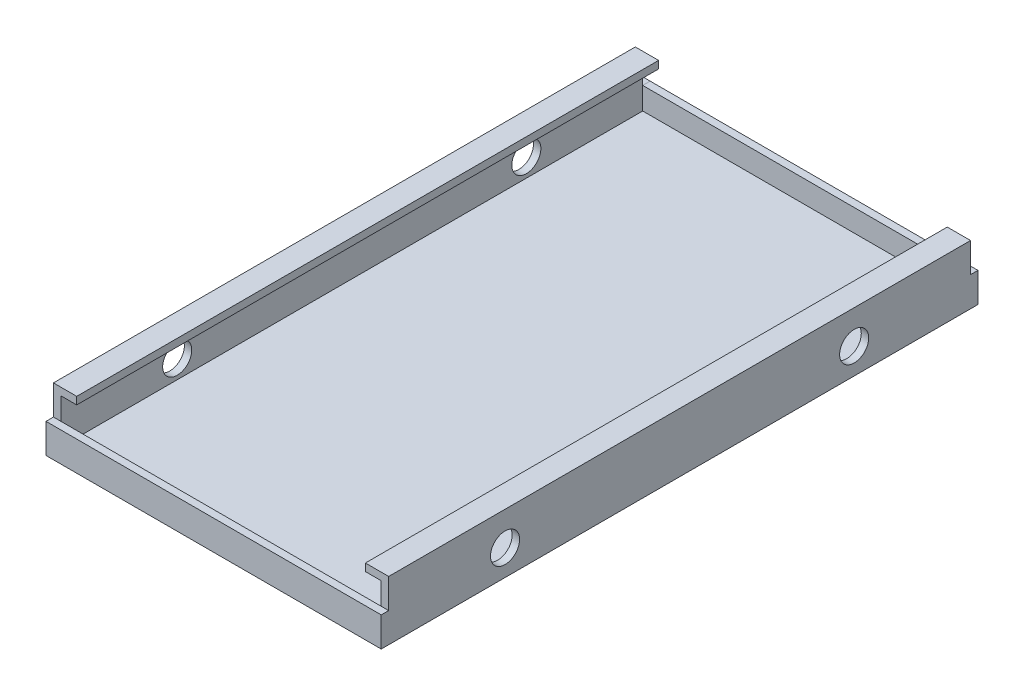
ISO-10303-21;
HEADER;
FILE_DESCRIPTION(('STEP AP214'),'2;1');
FILE_NAME('part.step','',(''),(''),'','','');
FILE_SCHEMA(('AUTOMOTIVE_DESIGN { 1 0 10303 214 1 1 1 1 }'));
ENDSEC;
DATA;
#1=APPLICATION_CONTEXT('core data for automotive mechanical design processes');
#2=APPLICATION_PROTOCOL_DEFINITION('international standard','automotive_design',2000,#1);
#3=PRODUCT_CONTEXT('',#1,'mechanical');
#4=PRODUCT('Part','Part','',(#3));
#5=PRODUCT_RELATED_PRODUCT_CATEGORY('part','',(#4));
#6=PRODUCT_DEFINITION_FORMATION('','',#4);
#7=PRODUCT_DEFINITION_CONTEXT('part definition',#1,'design');
#8=PRODUCT_DEFINITION('design','',#6,#7);
#9=PRODUCT_DEFINITION_SHAPE('','',#8);
#10=(LENGTH_UNIT() NAMED_UNIT(*) SI_UNIT(.MILLI.,.METRE.));
#11=(NAMED_UNIT(*) PLANE_ANGLE_UNIT() SI_UNIT($,.RADIAN.));
#12=(NAMED_UNIT(*) SI_UNIT($,.STERADIAN.) SOLID_ANGLE_UNIT());
#13=UNCERTAINTY_MEASURE_WITH_UNIT(LENGTH_MEASURE(1.E-05),#10,'distance_accuracy_value','');
#14=(GEOMETRIC_REPRESENTATION_CONTEXT(3) GLOBAL_UNCERTAINTY_ASSIGNED_CONTEXT((#13)) GLOBAL_UNIT_ASSIGNED_CONTEXT((#10,
#11,#12)) REPRESENTATION_CONTEXT('',''));
#15=CARTESIAN_POINT('',(0.,0.,0.));
#16=DIRECTION('',(0.,0.,1.));
#17=DIRECTION('',(1.,0.,0.));
#18=AXIS2_PLACEMENT_3D('',#15,#16,#17);
#19=CARTESIAN_POINT('',(0.,0.,500.));
#20=DIRECTION('',(0.,0.,1.));
#21=DIRECTION('',(1.,0.,0.));
#22=AXIS2_PLACEMENT_3D('',#19,#20,#21);
#23=PLANE('',#22);
#24=DIRECTION('',(-1.,0.,0.));
#25=VECTOR('',#24,1.);
#26=CARTESIAN_POINT('',(-76.2,0.0250000000000146,500.));
#27=LINE('',#26,#25);
#28=CARTESIAN_POINT('',(211.865528702967,0.0250000000000042,500.));
#29=VERTEX_POINT('',#28);
#30=CARTESIAN_POINT('',(205.465528702967,0.0250000000000042,500.));
#31=VERTEX_POINT('',#30);
#32=EDGE_CURVE('E46',#29,#31,#27,.T.);
#33=ORIENTED_EDGE('',*,*,#32,.F.);
#34=DIRECTION('',(0.,1.,0.));
#35=VECTOR('',#34,1.);
#36=CARTESIAN_POINT('',(211.865528702967,-25.4,500.));
#37=LINE('',#36,#35);
#38=CARTESIAN_POINT('',(211.865528702967,25.45,500.));
#39=VERTEX_POINT('',#38);
#40=EDGE_CURVE('E311',#29,#39,#37,.T.);
#41=ORIENTED_EDGE('',*,*,#40,.T.);
#42=DIRECTION('',(1.,0.,0.));
#43=VECTOR('',#42,1.);
#44=CARTESIAN_POINT('',(191.865528702967,25.45,500.));
#45=LINE('',#44,#43);
#46=CARTESIAN_POINT('',(191.865528702967,25.45,500.));
#47=VERTEX_POINT('',#46);
#48=EDGE_CURVE('E282',#47,#39,#45,.T.);
#49=ORIENTED_EDGE('',*,*,#48,.F.);
#50=DIRECTION('',(0.,-1.,0.));
#51=VECTOR('',#50,1.);
#52=CARTESIAN_POINT('',(191.865528702967,19.05,500.));
#53=LINE('',#52,#51);
#54=CARTESIAN_POINT('',(191.865528702967,19.05,500.));
#55=VERTEX_POINT('',#54);
#56=EDGE_CURVE('E272',#47,#55,#53,.T.);
#57=ORIENTED_EDGE('',*,*,#56,.T.);
#58=DIRECTION('',(1.,0.,0.));
#59=VECTOR('',#58,1.);
#60=CARTESIAN_POINT('',(191.865528702967,19.05,500.));
#61=LINE('',#60,#59);
#62=CARTESIAN_POINT('',(205.465528702967,19.05,500.));
#63=VERTEX_POINT('',#62);
#64=EDGE_CURVE('E278',#55,#63,#61,.T.);
#65=ORIENTED_EDGE('',*,*,#64,.T.);
#66=DIRECTION('',(0.,-1.,0.));
#67=VECTOR('',#66,1.);
#68=CARTESIAN_POINT('',(205.465528702967,-19.0497371809529,500.));
#69=LINE('',#68,#67);
#70=EDGE_CURVE('E314',#63,#31,#69,.T.);
#71=ORIENTED_EDGE('',*,*,#70,.T.);
#72=EDGE_LOOP('',(#33,#41,#49,#57,#65,#71));
#73=FACE_BOUND('',#72,.T.);
#74=ADVANCED_FACE('F35',(#73),#23,.T.);
#75=CARTESIAN_POINT('',(0.,0.,0.));
#76=DIRECTION('',(0.,0.,1.));
#77=DIRECTION('',(1.,0.,0.));
#78=AXIS2_PLACEMENT_3D('',#75,#76,#77);
#79=PLANE('',#78);
#80=DIRECTION('',(0.999992450686169,0.00388568792744622,0.));
#81=VECTOR('',#80,1.);
#82=CARTESIAN_POINT('',(205.465528702967,0.000131409523540515,0.));
#83=LINE('',#82,#81);
#84=CARTESIAN_POINT('',(205.465528702967,0.000131409523533577,0.));
#85=VERTEX_POINT('',#84);
#86=CARTESIAN_POINT('',(211.865528702967,0.024999999999992,0.));
#87=VERTEX_POINT('',#86);
#88=EDGE_CURVE('E205',#85,#87,#83,.T.);
#89=ORIENTED_EDGE('',*,*,#88,.F.);
#90=DIRECTION('',(0.,-1.,0.));
#91=VECTOR('',#90,1.);
#92=CARTESIAN_POINT('',(205.465528702967,-19.0497371809529,0.));
#93=LINE('',#92,#91);
#94=CARTESIAN_POINT('',(205.465528702967,19.05,0.));
#95=VERTEX_POINT('',#94);
#96=EDGE_CURVE('E329',#95,#85,#93,.T.);
#97=ORIENTED_EDGE('',*,*,#96,.F.);
#98=DIRECTION('',(1.,0.,0.));
#99=VECTOR('',#98,1.);
#100=CARTESIAN_POINT('',(191.865528702967,19.05,0.));
#101=LINE('',#100,#99);
#102=CARTESIAN_POINT('',(191.865528702967,19.05,0.));
#103=VERTEX_POINT('',#102);
#104=EDGE_CURVE('E275',#103,#95,#101,.T.);
#105=ORIENTED_EDGE('',*,*,#104,.F.);
#106=DIRECTION('',(0.,1.,0.));
#107=VECTOR('',#106,1.);
#108=CARTESIAN_POINT('',(191.865528702967,25.45,0.));
#109=LINE('',#108,#107);
#110=CARTESIAN_POINT('',(191.865528702967,25.45,0.));
#111=VERTEX_POINT('',#110);
#112=EDGE_CURVE('E266',#103,#111,#109,.T.);
#113=ORIENTED_EDGE('',*,*,#112,.T.);
#114=DIRECTION('',(1.,0.,0.));
#115=VECTOR('',#114,1.);
#116=CARTESIAN_POINT('',(191.865528702967,25.45,0.));
#117=LINE('',#116,#115);
#118=CARTESIAN_POINT('',(211.865528702967,25.45,0.));
#119=VERTEX_POINT('',#118);
#120=EDGE_CURVE('E285',#111,#119,#117,.T.);
#121=ORIENTED_EDGE('',*,*,#120,.T.);
#122=DIRECTION('',(0.,1.,0.));
#123=VECTOR('',#122,1.);
#124=CARTESIAN_POINT('',(211.865528702967,-25.4,0.));
#125=LINE('',#124,#123);
#126=EDGE_CURVE('E326',#87,#119,#125,.T.);
#127=ORIENTED_EDGE('',*,*,#126,.F.);
#128=EDGE_LOOP('',(#89,#97,#105,#113,#121,#127));
#129=FACE_BOUND('',#128,.T.);
#130=ADVANCED_FACE('F410',(#129),#79,.F.);
#131=DIRECTION('',(0.999992331332652,-0.00391628342795909,0.));
#132=VECTOR('',#131,1.);
#133=CARTESIAN_POINT('',(-76.2,0.0250000000000146,0.));
#134=LINE('',#133,#132);
#135=CARTESIAN_POINT('',(-76.2,0.0250000000000129,0.));
#136=VERTEX_POINT('',#135);
#137=CARTESIAN_POINT('',(-69.85,0.000131409523526638,0.));
#138=VERTEX_POINT('',#137);
#139=EDGE_CURVE('E202',#136,#138,#134,.T.);
#140=ORIENTED_EDGE('',*,*,#139,.F.);
#141=DIRECTION('',(0.,-1.,0.));
#142=VECTOR('',#141,1.);
#143=CARTESIAN_POINT('',(-76.2,-25.4,0.));
#144=LINE('',#143,#142);
#145=CARTESIAN_POINT('',(-76.2,25.45,0.));
#146=VERTEX_POINT('',#145);
#147=EDGE_CURVE('E308',#146,#136,#144,.T.);
#148=ORIENTED_EDGE('',*,*,#147,.F.);
#149=DIRECTION('',(-1.,0.,0.));
#150=VECTOR('',#149,1.);
#151=CARTESIAN_POINT('',(-56.2,25.45,0.));
#152=LINE('',#151,#150);
#153=CARTESIAN_POINT('',(-56.2,25.45,0.));
#154=VERTEX_POINT('',#153);
#155=EDGE_CURVE('E255',#154,#146,#152,.T.);
#156=ORIENTED_EDGE('',*,*,#155,.F.);
#157=DIRECTION('',(0.,-1.,0.));
#158=VECTOR('',#157,1.);
#159=CARTESIAN_POINT('',(-56.2,19.05,0.));
#160=LINE('',#159,#158);
#161=CARTESIAN_POINT('',(-56.2,19.05,0.));
#162=VERTEX_POINT('',#161);
#163=EDGE_CURVE('E245',#154,#162,#160,.T.);
#164=ORIENTED_EDGE('',*,*,#163,.T.);
#165=DIRECTION('',(-1.,0.,0.));
#166=VECTOR('',#165,1.);
#167=CARTESIAN_POINT('',(-56.2,19.05,0.));
#168=LINE('',#167,#166);
#169=CARTESIAN_POINT('',(-69.85,19.05,0.));
#170=VERTEX_POINT('',#169);
#171=EDGE_CURVE('E251',#162,#170,#168,.T.);
#172=ORIENTED_EDGE('',*,*,#171,.T.);
#173=DIRECTION('',(0.,1.,0.));
#174=VECTOR('',#173,1.);
#175=CARTESIAN_POINT('',(-69.85,19.05,0.));
#176=LINE('',#175,#174);
#177=EDGE_CURVE('E334',#138,#170,#176,.T.);
#178=ORIENTED_EDGE('',*,*,#177,.F.);
#179=EDGE_LOOP('',(#140,#148,#156,#164,#172,#178));
#180=FACE_BOUND('',#179,.T.);
#181=ADVANCED_FACE('F363',(#180),#79,.F.);
#182=CARTESIAN_POINT('',(-76.2,-25.4,500.));
#183=DIRECTION('',(1.,0.,0.));
#184=DIRECTION('',(0.,0.,-1.));
#185=AXIS2_PLACEMENT_3D('',#182,#183,#184);
#186=PLANE('',#185);
#187=CARTESIAN_POINT('',(-76.2,-3.19999999999985,400.));
#188=DIRECTION('',(1.,0.,0.));
#189=DIRECTION('',(0.,0.,-1.));
#190=AXIS2_PLACEMENT_3D('',#187,#188,#189);
#191=CIRCLE('',#190,12.5);
#192=CARTESIAN_POINT('',(-76.2,-3.19999999999985,387.5));
#193=VERTEX_POINT('',#192);
#194=EDGE_CURVE('E305',#193,#193,#191,.T.);
#195=ORIENTED_EDGE('',*,*,#194,.T.);
#196=EDGE_LOOP('',(#195));
#197=FACE_BOUND('',#196,.T.);
#198=CARTESIAN_POINT('',(-76.2,-3.19999999999985,100.));
#199=DIRECTION('',(1.,0.,0.));
#200=DIRECTION('',(0.,0.,-1.));
#201=AXIS2_PLACEMENT_3D('',#198,#199,#200);
#202=CIRCLE('',#201,12.5);
#203=CARTESIAN_POINT('',(-76.2,-3.19999999999985,87.5));
#204=VERTEX_POINT('',#203);
#205=EDGE_CURVE('E299',#204,#204,#202,.T.);
#206=ORIENTED_EDGE('',*,*,#205,.T.);
#207=EDGE_LOOP('',(#206));
#208=FACE_BOUND('',#207,.T.);
#209=ORIENTED_EDGE('',*,*,#147,.T.);
#210=DIRECTION('',(0.,0.,1.));
#211=VECTOR('',#210,1.);
#212=CARTESIAN_POINT('',(-76.2,0.0250000000000146,-6.4));
#213=LINE('',#212,#211);
#214=CARTESIAN_POINT('',(-76.2,0.0250000000000146,-6.4));
#215=VERTEX_POINT('',#214);
#216=EDGE_CURVE('E232',#215,#136,#213,.T.);
#217=ORIENTED_EDGE('',*,*,#216,.F.);
#218=DIRECTION('',(0.,1.,0.));
#219=VECTOR('',#218,1.);
#220=CARTESIAN_POINT('',(-76.2,-25.4,-6.4));
#221=LINE('',#220,#219);
#222=CARTESIAN_POINT('',(-76.2,-25.4,-6.4));
#223=VERTEX_POINT('',#222);
#224=EDGE_CURVE('E207',#223,#215,#221,.T.);
#225=ORIENTED_EDGE('',*,*,#224,.F.);
#226=DIRECTION('',(0.,0.,-1.));
#227=VECTOR('',#226,1.);
#228=CARTESIAN_POINT('',(-76.2,-25.4,500.));
#229=LINE('',#228,#227);
#230=CARTESIAN_POINT('',(-76.2,-25.4,506.4));
#231=VERTEX_POINT('',#230);
#232=EDGE_CURVE('E44',#231,#223,#229,.T.);
#233=ORIENTED_EDGE('',*,*,#232,.F.);
#234=DIRECTION('',(0.,-1.,0.));
#235=VECTOR('',#234,1.);
#236=CARTESIAN_POINT('',(-76.2,-25.4,506.4));
#237=LINE('',#236,#235);
#238=CARTESIAN_POINT('',(-76.2,0.0250000000000146,506.4));
#239=VERTEX_POINT('',#238);
#240=EDGE_CURVE('E192',#239,#231,#237,.T.);
#241=ORIENTED_EDGE('',*,*,#240,.F.);
#242=DIRECTION('',(0.,0.,-1.));
#243=VECTOR('',#242,1.);
#244=CARTESIAN_POINT('',(-76.2,0.0250000000000146,506.4));
#245=LINE('',#244,#243);
#246=CARTESIAN_POINT('',(-76.2,0.0250000000000146,500.));
#247=VERTEX_POINT('',#246);
#248=EDGE_CURVE('E197',#239,#247,#245,.T.);
#249=ORIENTED_EDGE('',*,*,#248,.T.);
#250=DIRECTION('',(0.,-1.,0.));
#251=VECTOR('',#250,1.);
#252=CARTESIAN_POINT('',(-76.2,-25.4,500.));
#253=LINE('',#252,#251);
#254=CARTESIAN_POINT('',(-76.2,25.45,500.));
#255=VERTEX_POINT('',#254);
#256=EDGE_CURVE('E309',#255,#247,#253,.T.);
#257=ORIENTED_EDGE('',*,*,#256,.F.);
#258=DIRECTION('',(0.,0.,-1.));
#259=VECTOR('',#258,1.);
#260=CARTESIAN_POINT('',(-76.2,25.45,0.));
#261=LINE('',#260,#259);
#262=EDGE_CURVE('E235',#255,#146,#261,.T.);
#263=ORIENTED_EDGE('',*,*,#262,.T.);
#264=EDGE_LOOP('',(#209,#217,#225,#233,#241,#249,#257,#263));
#265=FACE_BOUND('',#264,.T.);
#266=ADVANCED_FACE('F37',(#197,#208,#265),#186,.F.);
#267=CARTESIAN_POINT('',(76.2,-25.4,500.));
#268=DIRECTION('',(0.,1.,0.));
#269=DIRECTION('',(0.,0.,1.));
#270=AXIS2_PLACEMENT_3D('',#267,#268,#269);
#271=PLANE('',#270);
#272=ORIENTED_EDGE('',*,*,#232,.T.);
#273=DIRECTION('',(-1.,0.,0.));
#274=VECTOR('',#273,1.);
#275=CARTESIAN_POINT('',(211.865528702967,-25.4,-6.4));
#276=LINE('',#275,#274);
#277=CARTESIAN_POINT('',(211.865528702967,-25.4,-6.4));
#278=VERTEX_POINT('',#277);
#279=EDGE_CURVE('E174',#278,#223,#276,.T.);
#280=ORIENTED_EDGE('',*,*,#279,.F.);
#281=DIRECTION('',(0.,0.,-1.));
#282=VECTOR('',#281,1.);
#283=CARTESIAN_POINT('',(211.865528702967,-25.4,500.));
#284=LINE('',#283,#282);
#285=CARTESIAN_POINT('',(211.865528702967,-25.4,506.4));
#286=VERTEX_POINT('',#285);
#287=EDGE_CURVE('E168',#286,#278,#284,.T.);
#288=ORIENTED_EDGE('',*,*,#287,.F.);
#289=DIRECTION('',(1.,0.,0.));
#290=VECTOR('',#289,1.);
#291=CARTESIAN_POINT('',(211.865528702967,-25.4,506.4));
#292=LINE('',#291,#290);
#293=EDGE_CURVE('E172',#231,#286,#292,.T.);
#294=ORIENTED_EDGE('',*,*,#293,.F.);
#295=EDGE_LOOP('',(#272,#280,#288,#294));
#296=FACE_BOUND('',#295,.T.);
#297=ADVANCED_FACE('F170',(#296),#271,.F.);
#298=CARTESIAN_POINT('',(211.865528702967,-25.4,500.));
#299=DIRECTION('',(-1.,0.,0.));
#300=DIRECTION('',(0.,-1.,0.));
#301=AXIS2_PLACEMENT_3D('',#298,#299,#300);
#302=PLANE('',#301);
#303=CARTESIAN_POINT('',(211.865528702967,-3.20000000000001,400.));
#304=DIRECTION('',(1.,0.,0.));
#305=DIRECTION('',(0.,1.,0.));
#306=AXIS2_PLACEMENT_3D('',#303,#304,#305);
#307=CIRCLE('',#306,12.5);
#308=CARTESIAN_POINT('',(211.865528702967,9.3,400.));
#309=VERTEX_POINT('',#308);
#310=EDGE_CURVE('E290',#309,#309,#307,.T.);
#311=ORIENTED_EDGE('',*,*,#310,.F.);
#312=EDGE_LOOP('',(#311));
#313=FACE_BOUND('',#312,.T.);
#314=CARTESIAN_POINT('',(211.865528702967,-3.20000000000001,100.));
#315=DIRECTION('',(1.,0.,0.));
#316=DIRECTION('',(0.,1.,0.));
#317=AXIS2_PLACEMENT_3D('',#314,#315,#316);
#318=CIRCLE('',#317,12.5);
#319=CARTESIAN_POINT('',(211.865528702967,9.3,100.));
#320=VERTEX_POINT('',#319);
#321=EDGE_CURVE('E281',#320,#320,#318,.T.);
#322=ORIENTED_EDGE('',*,*,#321,.F.);
#323=EDGE_LOOP('',(#322));
#324=FACE_BOUND('',#323,.T.);
#325=ORIENTED_EDGE('',*,*,#287,.T.);
#326=DIRECTION('',(0.,-1.,0.));
#327=VECTOR('',#326,1.);
#328=CARTESIAN_POINT('',(211.865528702967,-25.4,-6.4));
#329=LINE('',#328,#327);
#330=CARTESIAN_POINT('',(211.865528702967,0.0249999999999903,-6.4));
#331=VERTEX_POINT('',#330);
#332=EDGE_CURVE('E203',#331,#278,#329,.T.);
#333=ORIENTED_EDGE('',*,*,#332,.F.);
#334=DIRECTION('',(0.,0.,1.));
#335=VECTOR('',#334,1.);
#336=CARTESIAN_POINT('',(211.865528702967,0.0249999999999903,-6.4));
#337=LINE('',#336,#335);
#338=EDGE_CURVE('E216',#331,#87,#337,.T.);
#339=ORIENTED_EDGE('',*,*,#338,.T.);
#340=ORIENTED_EDGE('',*,*,#126,.T.);
#341=DIRECTION('',(0.,0.,1.));
#342=VECTOR('',#341,1.);
#343=CARTESIAN_POINT('',(211.865528702967,25.45,500.));
#344=LINE('',#343,#342);
#345=EDGE_CURVE('E254',#119,#39,#344,.T.);
#346=ORIENTED_EDGE('',*,*,#345,.T.);
#347=ORIENTED_EDGE('',*,*,#40,.F.);
#348=DIRECTION('',(0.,0.,-1.));
#349=VECTOR('',#348,1.);
#350=CARTESIAN_POINT('',(211.865528702967,0.0249999999999903,506.4));
#351=LINE('',#350,#349);
#352=CARTESIAN_POINT('',(211.865528702967,0.0249999999999903,506.4));
#353=VERTEX_POINT('',#352);
#354=EDGE_CURVE('E184',#353,#29,#351,.T.);
#355=ORIENTED_EDGE('',*,*,#354,.F.);
#356=DIRECTION('',(0.,1.,0.));
#357=VECTOR('',#356,1.);
#358=CARTESIAN_POINT('',(211.865528702967,0.0249999999999903,506.4));
#359=LINE('',#358,#357);
#360=EDGE_CURVE('E180',#286,#353,#359,.T.);
#361=ORIENTED_EDGE('',*,*,#360,.F.);
#362=EDGE_LOOP('',(#325,#333,#339,#340,#346,#347,#355,#361));
#363=FACE_BOUND('',#362,.T.);
#364=ADVANCED_FACE('F181',(#313,#324,#363),#302,.F.);
#365=CARTESIAN_POINT('',(205.465528702967,-19.0497371809529,500.));
#366=DIRECTION('',(1.,0.,0.));
#367=DIRECTION('',(0.,0.,-1.));
#368=AXIS2_PLACEMENT_3D('',#365,#366,#367);
#369=PLANE('',#368);
#370=CARTESIAN_POINT('',(205.465528702967,-3.2,400.));
#371=DIRECTION('',(1.,0.,0.));
#372=DIRECTION('',(0.,0.,-1.));
#373=AXIS2_PLACEMENT_3D('',#370,#371,#372);
#374=CIRCLE('',#373,12.5);
#375=CARTESIAN_POINT('',(205.465528702967,-3.2,387.5));
#376=VERTEX_POINT('',#375);
#377=EDGE_CURVE('E302',#376,#376,#374,.T.);
#378=ORIENTED_EDGE('',*,*,#377,.T.);
#379=EDGE_LOOP('',(#378));
#380=FACE_BOUND('',#379,.T.);
#381=CARTESIAN_POINT('',(205.465528702967,-3.2,100.));
#382=DIRECTION('',(1.,0.,0.));
#383=DIRECTION('',(0.,0.,-1.));
#384=AXIS2_PLACEMENT_3D('',#381,#382,#383);
#385=CIRCLE('',#384,12.5);
#386=CARTESIAN_POINT('',(205.465528702967,-3.2,87.5));
#387=VERTEX_POINT('',#386);
#388=EDGE_CURVE('E296',#387,#387,#385,.T.);
#389=ORIENTED_EDGE('',*,*,#388,.T.);
#390=EDGE_LOOP('',(#389));
#391=FACE_BOUND('',#390,.T.);
#392=ORIENTED_EDGE('',*,*,#96,.T.);
#393=CARTESIAN_POINT('',(205.465528702967,-19.0497371809529,0.));
#394=VERTEX_POINT('',#393);
#395=EDGE_CURVE('E328',#85,#394,#93,.T.);
#396=ORIENTED_EDGE('',*,*,#395,.T.);
#397=DIRECTION('',(0.,0.,-1.));
#398=VECTOR('',#397,1.);
#399=CARTESIAN_POINT('',(205.465528702967,-19.0497371809529,500.));
#400=LINE('',#399,#398);
#401=CARTESIAN_POINT('',(205.465528702967,-19.0497371809529,500.));
#402=VERTEX_POINT('',#401);
#403=EDGE_CURVE('E341',#402,#394,#400,.T.);
#404=ORIENTED_EDGE('',*,*,#403,.F.);
#405=EDGE_CURVE('E60',#31,#402,#69,.T.);
#406=ORIENTED_EDGE('',*,*,#405,.F.);
#407=ORIENTED_EDGE('',*,*,#70,.F.);
#408=DIRECTION('',(0.,0.,-1.));
#409=VECTOR('',#408,1.);
#410=CARTESIAN_POINT('',(205.465528702967,19.05,500.));
#411=LINE('',#410,#409);
#412=EDGE_CURVE('E177',#63,#95,#411,.T.);
#413=ORIENTED_EDGE('',*,*,#412,.T.);
#414=EDGE_LOOP('',(#392,#396,#404,#406,#407,#413));
#415=FACE_BOUND('',#414,.T.);
#416=ADVANCED_FACE('F428',(#380,#391,#415),#369,.F.);
#417=CARTESIAN_POINT('',(-69.85,-19.0497371809529,500.));
#418=DIRECTION('',(0.,-1.,0.));
#419=DIRECTION('',(0.,0.,-1.));
#420=AXIS2_PLACEMENT_3D('',#417,#418,#419);
#421=PLANE('',#420);
#422=DIRECTION('',(-1.,0.,0.));
#423=VECTOR('',#422,1.);
#424=CARTESIAN_POINT('',(-69.85,-19.0497371809529,0.));
#425=LINE('',#424,#423);
#426=CARTESIAN_POINT('',(-69.85,-19.0497371809529,0.));
#427=VERTEX_POINT('',#426);
#428=EDGE_CURVE('E332',#394,#427,#425,.T.);
#429=ORIENTED_EDGE('',*,*,#428,.T.);
#430=DIRECTION('',(0.,0.,-1.));
#431=VECTOR('',#430,1.);
#432=CARTESIAN_POINT('',(-69.85,-19.0497371809529,500.));
#433=LINE('',#432,#431);
#434=CARTESIAN_POINT('',(-69.85,-19.0497371809529,500.));
#435=VERTEX_POINT('',#434);
#436=EDGE_CURVE('E338',#435,#427,#433,.T.);
#437=ORIENTED_EDGE('',*,*,#436,.F.);
#438=DIRECTION('',(-1.,0.,0.));
#439=VECTOR('',#438,1.);
#440=CARTESIAN_POINT('',(69.85,-19.0497371809529,500.));
#441=LINE('',#440,#439);
#442=EDGE_CURVE('E316',#402,#435,#441,.T.);
#443=ORIENTED_EDGE('',*,*,#442,.F.);
#444=ORIENTED_EDGE('',*,*,#403,.T.);
#445=EDGE_LOOP('',(#429,#437,#443,#444));
#446=FACE_BOUND('',#445,.T.);
#447=ADVANCED_FACE('F422',(#446),#421,.F.);
#448=CARTESIAN_POINT('',(-69.85,19.05,500.));
#449=DIRECTION('',(-1.,0.,0.));
#450=DIRECTION('',(0.,0.,1.));
#451=AXIS2_PLACEMENT_3D('',#448,#449,#450);
#452=PLANE('',#451);
#453=CARTESIAN_POINT('',(-69.85,-3.19999999999985,400.));
#454=DIRECTION('',(-1.,0.,0.));
#455=DIRECTION('',(0.,0.,1.));
#456=AXIS2_PLACEMENT_3D('',#453,#454,#455);
#457=CIRCLE('',#456,12.5);
#458=CARTESIAN_POINT('',(-69.85,-3.19999999999985,412.5));
#459=VERTEX_POINT('',#458);
#460=EDGE_CURVE('E39',#459,#459,#457,.T.);
#461=ORIENTED_EDGE('',*,*,#460,.T.);
#462=EDGE_LOOP('',(#461));
#463=FACE_BOUND('',#462,.T.);
#464=CARTESIAN_POINT('',(-69.85,-3.19999999999985,100.));
#465=DIRECTION('',(-1.,0.,0.));
#466=DIRECTION('',(0.,0.,1.));
#467=AXIS2_PLACEMENT_3D('',#464,#465,#466);
#468=CIRCLE('',#467,12.5);
#469=CARTESIAN_POINT('',(-69.85,-3.19999999999985,112.5));
#470=VERTEX_POINT('',#469);
#471=EDGE_CURVE('E293',#470,#470,#468,.T.);
#472=ORIENTED_EDGE('',*,*,#471,.T.);
#473=EDGE_LOOP('',(#472));
#474=FACE_BOUND('',#473,.T.);
#475=EDGE_CURVE('E312',#427,#138,#176,.T.);
#476=ORIENTED_EDGE('',*,*,#475,.T.);
#477=ORIENTED_EDGE('',*,*,#177,.T.);
#478=DIRECTION('',(0.,0.,-1.));
#479=VECTOR('',#478,1.);
#480=CARTESIAN_POINT('',(-69.85,19.05,500.));
#481=LINE('',#480,#479);
#482=CARTESIAN_POINT('',(-69.85,19.05,500.));
#483=VERTEX_POINT('',#482);
#484=EDGE_CURVE('E323',#483,#170,#481,.T.);
#485=ORIENTED_EDGE('',*,*,#484,.F.);
#486=DIRECTION('',(0.,1.,0.));
#487=VECTOR('',#486,1.);
#488=CARTESIAN_POINT('',(-69.85,19.05,500.));
#489=LINE('',#488,#487);
#490=CARTESIAN_POINT('',(-69.85,0.0250000000000007,500.));
#491=VERTEX_POINT('',#490);
#492=EDGE_CURVE('E319',#491,#483,#489,.T.);
#493=ORIENTED_EDGE('',*,*,#492,.F.);
#494=EDGE_CURVE('E320',#435,#491,#489,.T.);
#495=ORIENTED_EDGE('',*,*,#494,.F.);
#496=ORIENTED_EDGE('',*,*,#436,.T.);
#497=EDGE_LOOP('',(#476,#477,#485,#493,#495,#496));
#498=FACE_BOUND('',#497,.T.);
#499=ADVANCED_FACE('F349',(#463,#474,#498),#452,.F.);
#500=EDGE_CURVE('E11',#491,#247,#27,.T.);
#501=ORIENTED_EDGE('',*,*,#500,.F.);
#502=ORIENTED_EDGE('',*,*,#492,.T.);
#503=DIRECTION('',(-1.,0.,0.));
#504=VECTOR('',#503,1.);
#505=CARTESIAN_POINT('',(-56.2,19.05,500.));
#506=LINE('',#505,#504);
#507=CARTESIAN_POINT('',(-56.2,19.05,500.));
#508=VERTEX_POINT('',#507);
#509=EDGE_CURVE('E248',#508,#483,#506,.T.);
#510=ORIENTED_EDGE('',*,*,#509,.F.);
#511=DIRECTION('',(0.,1.,0.));
#512=VECTOR('',#511,1.);
#513=CARTESIAN_POINT('',(-56.2,25.45,500.));
#514=LINE('',#513,#512);
#515=CARTESIAN_POINT('',(-56.2,25.45,500.));
#516=VERTEX_POINT('',#515);
#517=EDGE_CURVE('E239',#508,#516,#514,.T.);
#518=ORIENTED_EDGE('',*,*,#517,.T.);
#519=DIRECTION('',(-1.,0.,0.));
#520=VECTOR('',#519,1.);
#521=CARTESIAN_POINT('',(-56.2,25.45,500.));
#522=LINE('',#521,#520);
#523=EDGE_CURVE('E258',#516,#255,#522,.T.);
#524=ORIENTED_EDGE('',*,*,#523,.T.);
#525=ORIENTED_EDGE('',*,*,#256,.T.);
#526=EDGE_LOOP('',(#501,#502,#510,#518,#524,#525));
#527=FACE_BOUND('',#526,.T.);
#528=ADVANCED_FACE('F356',(#527),#23,.T.);
#529=CARTESIAN_POINT('',(-273.782471297033,-3.19999999999974,100.));
#530=DIRECTION('',(1.,0.,0.));
#531=DIRECTION('',(0.,1.,0.));
#532=AXIS2_PLACEMENT_3D('',#529,#530,#531);
#533=CYLINDRICAL_SURFACE('',#532,12.5);
#534=ORIENTED_EDGE('',*,*,#471,.F.);
#535=EDGE_LOOP('',(#534));
#536=FACE_BOUND('',#535,.T.);
#537=ORIENTED_EDGE('',*,*,#205,.F.);
#538=EDGE_LOOP('',(#537));
#539=FACE_BOUND('',#538,.T.);
#540=ADVANCED_FACE('F352',(#536,#539),#533,.F.);
#541=CARTESIAN_POINT('',(-273.782471297033,-3.19999999999974,400.));
#542=DIRECTION('',(1.,0.,0.));
#543=DIRECTION('',(0.,1.,0.));
#544=AXIS2_PLACEMENT_3D('',#541,#542,#543);
#545=CYLINDRICAL_SURFACE('',#544,12.5);
#546=ORIENTED_EDGE('',*,*,#460,.F.);
#547=EDGE_LOOP('',(#546));
#548=FACE_BOUND('',#547,.T.);
#549=ORIENTED_EDGE('',*,*,#194,.F.);
#550=EDGE_LOOP('',(#549));
#551=FACE_BOUND('',#550,.T.);
#552=ADVANCED_FACE('F355',(#548,#551),#545,.F.);
#553=ORIENTED_EDGE('',*,*,#321,.T.);
#554=EDGE_LOOP('',(#553));
#555=FACE_BOUND('',#554,.T.);
#556=ORIENTED_EDGE('',*,*,#388,.F.);
#557=EDGE_LOOP('',(#556));
#558=FACE_BOUND('',#557,.T.);
#559=ADVANCED_FACE('F358',(#555,#558),#533,.F.);
#560=ORIENTED_EDGE('',*,*,#310,.T.);
#561=EDGE_LOOP('',(#560));
#562=FACE_BOUND('',#561,.T.);
#563=ORIENTED_EDGE('',*,*,#377,.F.);
#564=EDGE_LOOP('',(#563));
#565=FACE_BOUND('',#564,.T.);
#566=ADVANCED_FACE('F627',(#562,#565),#545,.F.);
#567=CARTESIAN_POINT('',(191.865528702967,19.05,0.));
#568=DIRECTION('',(0.,-1.,0.));
#569=DIRECTION('',(1.,0.,0.));
#570=AXIS2_PLACEMENT_3D('',#567,#568,#569);
#571=PLANE('',#570);
#572=ORIENTED_EDGE('',*,*,#412,.F.);
#573=ORIENTED_EDGE('',*,*,#64,.F.);
#574=DIRECTION('',(0.,0.,-1.));
#575=VECTOR('',#574,1.);
#576=CARTESIAN_POINT('',(191.865528702967,19.05,0.));
#577=LINE('',#576,#575);
#578=EDGE_CURVE('E263',#55,#103,#577,.T.);
#579=ORIENTED_EDGE('',*,*,#578,.T.);
#580=ORIENTED_EDGE('',*,*,#104,.T.);
#581=EDGE_LOOP('',(#572,#573,#579,#580));
#582=FACE_BOUND('',#581,.T.);
#583=ADVANCED_FACE('F617',(#582),#571,.T.);
#584=CARTESIAN_POINT('',(191.865528702967,25.45,500.));
#585=DIRECTION('',(0.,1.,0.));
#586=DIRECTION('',(-1.,0.,0.));
#587=AXIS2_PLACEMENT_3D('',#584,#585,#586);
#588=PLANE('',#587);
#589=ORIENTED_EDGE('',*,*,#345,.F.);
#590=ORIENTED_EDGE('',*,*,#120,.F.);
#591=DIRECTION('',(0.,0.,1.));
#592=VECTOR('',#591,1.);
#593=CARTESIAN_POINT('',(191.865528702967,25.45,500.));
#594=LINE('',#593,#592);
#595=EDGE_CURVE('E269',#111,#47,#594,.T.);
#596=ORIENTED_EDGE('',*,*,#595,.T.);
#597=ORIENTED_EDGE('',*,*,#48,.T.);
#598=EDGE_LOOP('',(#589,#590,#596,#597));
#599=FACE_BOUND('',#598,.T.);
#600=ADVANCED_FACE('F607',(#599),#588,.T.);
#601=CARTESIAN_POINT('',(191.865528702967,-9.0633181800715E-13,0.));
#602=DIRECTION('',(-1.,0.,0.));
#603=DIRECTION('',(0.,-1.,0.));
#604=AXIS2_PLACEMENT_3D('',#601,#602,#603);
#605=PLANE('',#604);
#606=ORIENTED_EDGE('',*,*,#578,.F.);
#607=ORIENTED_EDGE('',*,*,#56,.F.);
#608=ORIENTED_EDGE('',*,*,#595,.F.);
#609=ORIENTED_EDGE('',*,*,#112,.F.);
#610=EDGE_LOOP('',(#606,#607,#608,#609));
#611=FACE_BOUND('',#610,.T.);
#612=ADVANCED_FACE('F407',(#611),#605,.T.);
#613=CARTESIAN_POINT('',(-56.2,19.05,500.));
#614=DIRECTION('',(0.,-1.,0.));
#615=DIRECTION('',(0.,0.,-1.));
#616=AXIS2_PLACEMENT_3D('',#613,#614,#615);
#617=PLANE('',#616);
#618=ORIENTED_EDGE('',*,*,#484,.T.);
#619=ORIENTED_EDGE('',*,*,#171,.F.);
#620=DIRECTION('',(0.,0.,1.));
#621=VECTOR('',#620,1.);
#622=CARTESIAN_POINT('',(-56.2,19.05,500.));
#623=LINE('',#622,#621);
#624=EDGE_CURVE('E236',#162,#508,#623,.T.);
#625=ORIENTED_EDGE('',*,*,#624,.T.);
#626=ORIENTED_EDGE('',*,*,#509,.T.);
#627=EDGE_LOOP('',(#618,#619,#625,#626));
#628=FACE_BOUND('',#627,.T.);
#629=ADVANCED_FACE('F395',(#628),#617,.T.);
#630=CARTESIAN_POINT('',(-56.2,25.45,0.));
#631=DIRECTION('',(0.,1.,0.));
#632=DIRECTION('',(0.,0.,1.));
#633=AXIS2_PLACEMENT_3D('',#630,#631,#632);
#634=PLANE('',#633);
#635=ORIENTED_EDGE('',*,*,#262,.F.);
#636=ORIENTED_EDGE('',*,*,#523,.F.);
#637=DIRECTION('',(0.,0.,-1.));
#638=VECTOR('',#637,1.);
#639=CARTESIAN_POINT('',(-56.2,25.45,0.));
#640=LINE('',#639,#638);
#641=EDGE_CURVE('E242',#516,#154,#640,.T.);
#642=ORIENTED_EDGE('',*,*,#641,.T.);
#643=ORIENTED_EDGE('',*,*,#155,.T.);
#644=EDGE_LOOP('',(#635,#636,#642,#643));
#645=FACE_BOUND('',#644,.T.);
#646=ADVANCED_FACE('F398',(#645),#634,.T.);
#647=CARTESIAN_POINT('',(-56.2,0.,0.));
#648=DIRECTION('',(1.,0.,0.));
#649=DIRECTION('',(0.,0.,-1.));
#650=AXIS2_PLACEMENT_3D('',#647,#648,#649);
#651=PLANE('',#650);
#652=ORIENTED_EDGE('',*,*,#624,.F.);
#653=ORIENTED_EDGE('',*,*,#163,.F.);
#654=ORIENTED_EDGE('',*,*,#641,.F.);
#655=ORIENTED_EDGE('',*,*,#517,.F.);
#656=EDGE_LOOP('',(#652,#653,#654,#655));
#657=FACE_BOUND('',#656,.T.);
#658=ADVANCED_FACE('F393',(#657),#651,.T.);
#659=CARTESIAN_POINT('',(0.,0.,0.));
#660=DIRECTION('',(0.,0.,1.));
#661=DIRECTION('',(1.,0.,0.));
#662=AXIS2_PLACEMENT_3D('',#659,#660,#661);
#663=PLANE('',#662);
#664=ORIENTED_EDGE('',*,*,#475,.F.);
#665=ORIENTED_EDGE('',*,*,#428,.F.);
#666=ORIENTED_EDGE('',*,*,#395,.F.);
#667=DIRECTION('',(1.,0.,0.));
#668=VECTOR('',#667,1.);
#669=CARTESIAN_POINT('',(205.465528702967,0.000131409523540515,0.));
#670=LINE('',#669,#668);
#671=EDGE_CURVE('E219',#138,#85,#670,.T.);
#672=ORIENTED_EDGE('',*,*,#671,.F.);
#673=EDGE_LOOP('',(#664,#665,#666,#672));
#674=FACE_BOUND('',#673,.T.);
#675=ADVANCED_FACE('F405',(#674),#663,.T.);
#676=CARTESIAN_POINT('',(-76.2,0.0250000000000146,-6.4));
#677=DIRECTION('',(-0.00391628342795909,-0.999992331332652,0.));
#678=DIRECTION('',(0.999992331332652,-0.00391628342795909,0.));
#679=AXIS2_PLACEMENT_3D('',#676,#677,#678);
#680=PLANE('',#679);
#681=ORIENTED_EDGE('',*,*,#139,.T.);
#682=DIRECTION('',(0.,0.,1.));
#683=VECTOR('',#682,1.);
#684=CARTESIAN_POINT('',(-69.85,0.000131409523526638,-6.4));
#685=LINE('',#684,#683);
#686=CARTESIAN_POINT('',(-69.85,0.000131409523526638,-6.4));
#687=VERTEX_POINT('',#686);
#688=EDGE_CURVE('E229',#687,#138,#685,.T.);
#689=ORIENTED_EDGE('',*,*,#688,.F.);
#690=DIRECTION('',(0.999992331332652,-0.00391628342795909,0.));
#691=VECTOR('',#690,1.);
#692=CARTESIAN_POINT('',(-76.2,0.0250000000000146,-6.4));
#693=LINE('',#692,#691);
#694=EDGE_CURVE('E209',#215,#687,#693,.T.);
#695=ORIENTED_EDGE('',*,*,#694,.F.);
#696=ORIENTED_EDGE('',*,*,#216,.T.);
#697=EDGE_LOOP('',(#681,#689,#695,#696));
#698=FACE_BOUND('',#697,.T.);
#699=ADVANCED_FACE('F371',(#698),#680,.F.);
#700=CARTESIAN_POINT('',(205.465528702967,0.000131409523540515,-6.4));
#701=DIRECTION('',(0.,-1.,0.));
#702=DIRECTION('',(1.,0.,0.));
#703=AXIS2_PLACEMENT_3D('',#700,#701,#702);
#704=PLANE('',#703);
#705=ORIENTED_EDGE('',*,*,#671,.T.);
#706=DIRECTION('',(0.,0.,1.));
#707=VECTOR('',#706,1.);
#708=CARTESIAN_POINT('',(205.465528702967,0.000131409523540515,-6.4));
#709=LINE('',#708,#707);
#710=CARTESIAN_POINT('',(205.465528702967,0.000131409523540515,-6.4));
#711=VERTEX_POINT('',#710);
#712=EDGE_CURVE('E226',#711,#85,#709,.T.);
#713=ORIENTED_EDGE('',*,*,#712,.F.);
#714=DIRECTION('',(1.,0.,0.));
#715=VECTOR('',#714,1.);
#716=CARTESIAN_POINT('',(205.465528702967,0.000131409523540515,-6.4));
#717=LINE('',#716,#715);
#718=EDGE_CURVE('E211',#687,#711,#717,.T.);
#719=ORIENTED_EDGE('',*,*,#718,.F.);
#720=ORIENTED_EDGE('',*,*,#688,.T.);
#721=EDGE_LOOP('',(#705,#713,#719,#720));
#722=FACE_BOUND('',#721,.T.);
#723=ADVANCED_FACE('F506',(#722),#704,.F.);
#724=CARTESIAN_POINT('',(205.465528702967,0.000131409523540515,-6.4));
#725=DIRECTION('',(0.00388568792744622,-0.999992450686169,0.));
#726=DIRECTION('',(0.999992450686169,0.00388568792744622,0.));
#727=AXIS2_PLACEMENT_3D('',#724,#725,#726);
#728=PLANE('',#727);
#729=ORIENTED_EDGE('',*,*,#88,.T.);
#730=ORIENTED_EDGE('',*,*,#338,.F.);
#731=DIRECTION('',(0.999992450686169,0.00388568792744622,0.));
#732=VECTOR('',#731,1.);
#733=CARTESIAN_POINT('',(205.465528702967,0.000131409523540515,-6.4));
#734=LINE('',#733,#732);
#735=EDGE_CURVE('E213',#711,#331,#734,.T.);
#736=ORIENTED_EDGE('',*,*,#735,.F.);
#737=ORIENTED_EDGE('',*,*,#712,.T.);
#738=EDGE_LOOP('',(#729,#730,#736,#737));
#739=FACE_BOUND('',#738,.T.);
#740=ADVANCED_FACE('F500',(#739),#728,.F.);
#741=CARTESIAN_POINT('',(0.,0.,-6.4));
#742=DIRECTION('',(0.,0.,1.));
#743=DIRECTION('',(1.,0.,0.));
#744=AXIS2_PLACEMENT_3D('',#741,#742,#743);
#745=PLANE('',#744);
#746=ORIENTED_EDGE('',*,*,#332,.T.);
#747=ORIENTED_EDGE('',*,*,#279,.T.);
#748=ORIENTED_EDGE('',*,*,#224,.T.);
#749=ORIENTED_EDGE('',*,*,#694,.T.);
#750=ORIENTED_EDGE('',*,*,#718,.T.);
#751=ORIENTED_EDGE('',*,*,#735,.T.);
#752=EDGE_LOOP('',(#746,#747,#748,#749,#750,#751));
#753=FACE_BOUND('',#752,.T.);
#754=ADVANCED_FACE('F375',(#753),#745,.F.);
#755=CARTESIAN_POINT('',(-76.2,0.0250000000000146,506.4));
#756=DIRECTION('',(0.,-1.,0.));
#757=DIRECTION('',(1.,0.,0.));
#758=AXIS2_PLACEMENT_3D('',#755,#756,#757);
#759=PLANE('',#758);
#760=ORIENTED_EDGE('',*,*,#32,.T.);
#761=EDGE_CURVE('E47',#31,#491,#27,.T.);
#762=ORIENTED_EDGE('',*,*,#761,.T.);
#763=ORIENTED_EDGE('',*,*,#500,.T.);
#764=ORIENTED_EDGE('',*,*,#248,.F.);
#765=DIRECTION('',(-1.,0.,0.));
#766=VECTOR('',#765,1.);
#767=CARTESIAN_POINT('',(-76.2,0.0250000000000146,506.4));
#768=LINE('',#767,#766);
#769=EDGE_CURVE('E187',#353,#239,#768,.T.);
#770=ORIENTED_EDGE('',*,*,#769,.F.);
#771=ORIENTED_EDGE('',*,*,#354,.T.);
#772=EDGE_LOOP('',(#760,#762,#763,#764,#770,#771));
#773=FACE_BOUND('',#772,.T.);
#774=ADVANCED_FACE('F379',(#773),#759,.F.);
#775=CARTESIAN_POINT('',(0.,0.,506.4));
#776=DIRECTION('',(0.,0.,-1.));
#777=DIRECTION('',(-1.,0.,0.));
#778=AXIS2_PLACEMENT_3D('',#775,#776,#777);
#779=PLANE('',#778);
#780=ORIENTED_EDGE('',*,*,#293,.T.);
#781=ORIENTED_EDGE('',*,*,#360,.T.);
#782=ORIENTED_EDGE('',*,*,#769,.T.);
#783=ORIENTED_EDGE('',*,*,#240,.T.);
#784=EDGE_LOOP('',(#780,#781,#782,#783));
#785=FACE_BOUND('',#784,.T.);
#786=ADVANCED_FACE('F190',(#785),#779,.F.);
#787=CARTESIAN_POINT('',(0.,0.,500.));
#788=DIRECTION('',(0.,0.,-1.));
#789=DIRECTION('',(-1.,0.,0.));
#790=AXIS2_PLACEMENT_3D('',#787,#788,#789);
#791=PLANE('',#790);
#792=ORIENTED_EDGE('',*,*,#761,.F.);
#793=ORIENTED_EDGE('',*,*,#405,.T.);
#794=ORIENTED_EDGE('',*,*,#442,.T.);
#795=ORIENTED_EDGE('',*,*,#494,.T.);
#796=EDGE_LOOP('',(#792,#793,#794,#795));
#797=FACE_BOUND('',#796,.T.);
#798=ADVANCED_FACE('F383',(#797),#791,.T.);
#799=CLOSED_SHELL('',(#74,#130,#181,#266,#297,#364,#416,#447,#499,#528,#540,#552,#559,#566,#583,
#600,#612,#629,#646,#658,#675,#699,#723,#740,#754,#774,#786,#798));
#800=MANIFOLD_SOLID_BREP('B2',#799);
#801=ADVANCED_BREP_SHAPE_REPRESENTATION('',(#18,#800),#14);
#802=SHAPE_DEFINITION_REPRESENTATION(#9,#801);
ENDSEC;
END-ISO-10303-21;
